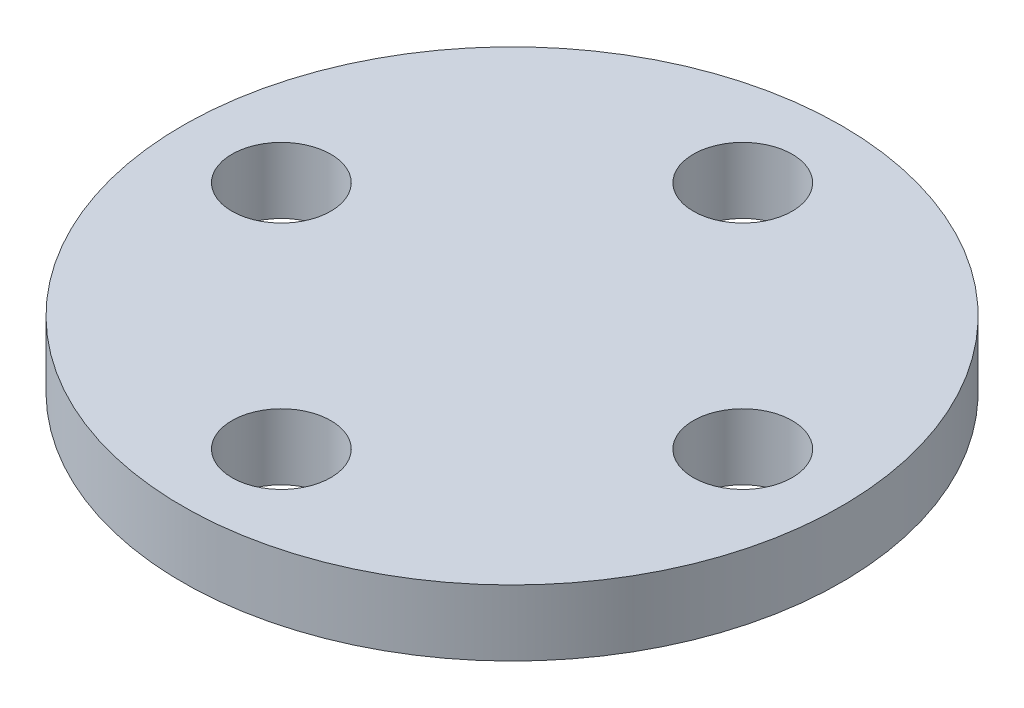
ISO-10303-21;
HEADER;
FILE_DESCRIPTION(('STEP AP214'),'2;1');
FILE_NAME('part.step','',(''),(''),'','','');
FILE_SCHEMA(('AUTOMOTIVE_DESIGN { 1 0 10303 214 1 1 1 1 }'));
ENDSEC;
DATA;
#1=APPLICATION_CONTEXT('core data for automotive mechanical design processes');
#2=APPLICATION_PROTOCOL_DEFINITION('international standard','automotive_design',2000,#1);
#3=PRODUCT_CONTEXT('',#1,'mechanical');
#4=PRODUCT('Part','Part','',(#3));
#5=PRODUCT_RELATED_PRODUCT_CATEGORY('part','',(#4));
#6=PRODUCT_DEFINITION_FORMATION('','',#4);
#7=PRODUCT_DEFINITION_CONTEXT('part definition',#1,'design');
#8=PRODUCT_DEFINITION('design','',#6,#7);
#9=PRODUCT_DEFINITION_SHAPE('','',#8);
#10=(LENGTH_UNIT() NAMED_UNIT(*) SI_UNIT(.MILLI.,.METRE.));
#11=(NAMED_UNIT(*) PLANE_ANGLE_UNIT() SI_UNIT($,.RADIAN.));
#12=(NAMED_UNIT(*) SI_UNIT($,.STERADIAN.) SOLID_ANGLE_UNIT());
#13=UNCERTAINTY_MEASURE_WITH_UNIT(LENGTH_MEASURE(1.E-05),#10,'distance_accuracy_value','');
#14=(GEOMETRIC_REPRESENTATION_CONTEXT(3) GLOBAL_UNCERTAINTY_ASSIGNED_CONTEXT((#13)) GLOBAL_UNIT_ASSIGNED_CONTEXT((#10,
#11,#12)) REPRESENTATION_CONTEXT('',''));
#15=CARTESIAN_POINT('',(0.,0.,0.));
#16=DIRECTION('',(0.,0.,1.));
#17=DIRECTION('',(1.,0.,0.));
#18=AXIS2_PLACEMENT_3D('',#15,#16,#17);
#19=CARTESIAN_POINT('',(0.,0.,0.));
#20=DIRECTION('',(0.,-1.,0.));
#21=DIRECTION('',(0.,0.,-1.));
#22=AXIS2_PLACEMENT_3D('',#19,#20,#21);
#23=CYLINDRICAL_SURFACE('',#22,2.75);
#24=CARTESIAN_POINT('',(0.,3.5,0.));
#25=DIRECTION('',(0.,-1.,0.));
#26=DIRECTION('',(0.,0.,-1.));
#27=AXIS2_PLACEMENT_3D('',#24,#25,#26);
#28=CIRCLE('',#27,2.75);
#29=CARTESIAN_POINT('',(0.,3.5,-2.75));
#30=VERTEX_POINT('',#29);
#31=EDGE_CURVE('E59',#30,#30,#28,.T.);
#32=ORIENTED_EDGE('',*,*,#31,.F.);
#33=EDGE_LOOP('',(#32));
#34=FACE_BOUND('',#33,.T.);
#35=CARTESIAN_POINT('',(0.,0.,0.));
#36=DIRECTION('',(0.,-1.,0.));
#37=DIRECTION('',(0.,0.,-1.));
#38=AXIS2_PLACEMENT_3D('',#35,#36,#37);
#39=CIRCLE('',#38,2.75);
#40=CARTESIAN_POINT('',(0.,0.,-2.75));
#41=VERTEX_POINT('',#40);
#42=EDGE_CURVE('E10',#41,#41,#39,.T.);
#43=ORIENTED_EDGE('',*,*,#42,.T.);
#44=EDGE_LOOP('',(#43));
#45=FACE_BOUND('',#44,.T.);
#46=ADVANCED_FACE('F37',(#34,#45),#23,.F.);
#47=CARTESIAN_POINT('',(-4.5,0.,0.));
#48=DIRECTION('',(0.,1.,0.));
#49=DIRECTION('',(0.,0.,1.));
#50=AXIS2_PLACEMENT_3D('',#47,#48,#49);
#51=PLANE('',#50);
#52=ORIENTED_EDGE('',*,*,#42,.F.);
#53=EDGE_LOOP('',(#52));
#54=FACE_BOUND('',#53,.T.);
#55=CARTESIAN_POINT('',(0.,0.,0.));
#56=DIRECTION('',(0.,-1.,0.));
#57=DIRECTION('',(0.,0.,-1.));
#58=AXIS2_PLACEMENT_3D('',#55,#56,#57);
#59=CIRCLE('',#58,4.5);
#60=CARTESIAN_POINT('',(0.,0.,-4.5));
#61=VERTEX_POINT('',#60);
#62=EDGE_CURVE('E43',#61,#61,#59,.T.);
#63=ORIENTED_EDGE('',*,*,#62,.T.);
#64=EDGE_LOOP('',(#63));
#65=FACE_BOUND('',#64,.T.);
#66=ADVANCED_FACE('F116',(#54,#65),#51,.F.);
#67=CARTESIAN_POINT('',(0.,0.,0.));
#68=DIRECTION('',(0.,-1.,0.));
#69=DIRECTION('',(0.,0.,-1.));
#70=AXIS2_PLACEMENT_3D('',#67,#68,#69);
#71=CYLINDRICAL_SURFACE('',#70,4.5);
#72=ORIENTED_EDGE('',*,*,#62,.F.);
#73=EDGE_LOOP('',(#72));
#74=FACE_BOUND('',#73,.T.);
#75=CARTESIAN_POINT('',(0.,2.5,0.));
#76=DIRECTION('',(0.,-1.,0.));
#77=DIRECTION('',(0.,0.,-1.));
#78=AXIS2_PLACEMENT_3D('',#75,#76,#77);
#79=CIRCLE('',#78,4.5);
#80=CARTESIAN_POINT('',(0.,2.5,-4.5));
#81=VERTEX_POINT('',#80);
#82=EDGE_CURVE('E47',#81,#81,#79,.T.);
#83=ORIENTED_EDGE('',*,*,#82,.T.);
#84=EDGE_LOOP('',(#83));
#85=FACE_BOUND('',#84,.T.);
#86=ADVANCED_FACE('F111',(#74,#85),#71,.T.);
#87=CARTESIAN_POINT('',(-10.,2.5,0.));
#88=DIRECTION('',(0.,1.,0.));
#89=DIRECTION('',(0.,0.,1.));
#90=AXIS2_PLACEMENT_3D('',#87,#88,#89);
#91=PLANE('',#90);
#92=CARTESIAN_POINT('',(0.,2.5,-7.));
#93=DIRECTION('',(0.,1.,0.));
#94=DIRECTION('',(0.,0.,1.));
#95=AXIS2_PLACEMENT_3D('',#92,#93,#94);
#96=CIRCLE('',#95,1.5);
#97=CARTESIAN_POINT('',(0.,2.5,-5.5));
#98=VERTEX_POINT('',#97);
#99=EDGE_CURVE('E62',#98,#98,#96,.F.);
#100=ORIENTED_EDGE('',*,*,#99,.F.);
#101=EDGE_LOOP('',(#100));
#102=FACE_BOUND('',#101,.T.);
#103=CARTESIAN_POINT('',(7.00000000000021,2.5,-2.04710281891367E-13));
#104=DIRECTION('',(0.,1.,0.));
#105=DIRECTION('',(0.,0.,1.));
#106=AXIS2_PLACEMENT_3D('',#103,#104,#105);
#107=CIRCLE('',#106,1.5);
#108=CARTESIAN_POINT('',(7.00000000000021,2.5,1.4999999999998));
#109=VERTEX_POINT('',#108);
#110=EDGE_CURVE('E73',#109,#109,#107,.F.);
#111=ORIENTED_EDGE('',*,*,#110,.F.);
#112=EDGE_LOOP('',(#111));
#113=FACE_BOUND('',#112,.T.);
#114=CARTESIAN_POINT('',(4.09420563782734E-13,2.5,7.));
#115=DIRECTION('',(0.,1.,0.));
#116=DIRECTION('',(0.,0.,1.));
#117=AXIS2_PLACEMENT_3D('',#114,#115,#116);
#118=CIRCLE('',#117,1.5);
#119=CARTESIAN_POINT('',(4.09420563782734E-13,2.5,8.5));
#120=VERTEX_POINT('',#119);
#121=EDGE_CURVE('E66',#120,#120,#118,.F.);
#122=ORIENTED_EDGE('',*,*,#121,.F.);
#123=EDGE_LOOP('',(#122));
#124=FACE_BOUND('',#123,.T.);
#125=CARTESIAN_POINT('',(-6.9999999999998,2.5,2.0556753465077E-13));
#126=DIRECTION('',(0.,1.,0.));
#127=DIRECTION('',(0.,0.,1.));
#128=AXIS2_PLACEMENT_3D('',#125,#126,#127);
#129=CIRCLE('',#128,1.5);
#130=CARTESIAN_POINT('',(-6.9999999999998,2.5,1.50000000000021));
#131=VERTEX_POINT('',#130);
#132=EDGE_CURVE('E67',#131,#131,#129,.F.);
#133=ORIENTED_EDGE('',*,*,#132,.F.);
#134=EDGE_LOOP('',(#133));
#135=FACE_BOUND('',#134,.T.);
#136=ORIENTED_EDGE('',*,*,#82,.F.);
#137=EDGE_LOOP('',(#136));
#138=FACE_BOUND('',#137,.T.);
#139=CARTESIAN_POINT('',(0.,2.5,0.));
#140=DIRECTION('',(0.,-1.,0.));
#141=DIRECTION('',(0.,0.,-1.));
#142=AXIS2_PLACEMENT_3D('',#139,#140,#141);
#143=CIRCLE('',#142,10.);
#144=CARTESIAN_POINT('',(0.,2.5,-10.));
#145=VERTEX_POINT('',#144);
#146=EDGE_CURVE('E51',#145,#145,#143,.T.);
#147=ORIENTED_EDGE('',*,*,#146,.T.);
#148=EDGE_LOOP('',(#147));
#149=FACE_BOUND('',#148,.T.);
#150=ADVANCED_FACE('F105',(#102,#113,#124,#135,#138,#149),#91,.F.);
#151=CARTESIAN_POINT('',(0.,0.,0.));
#152=DIRECTION('',(0.,-1.,0.));
#153=DIRECTION('',(0.,0.,-1.));
#154=AXIS2_PLACEMENT_3D('',#151,#152,#153);
#155=CYLINDRICAL_SURFACE('',#154,10.);
#156=ORIENTED_EDGE('',*,*,#146,.F.);
#157=EDGE_LOOP('',(#156));
#158=FACE_BOUND('',#157,.T.);
#159=CARTESIAN_POINT('',(0.,4.5,0.));
#160=DIRECTION('',(0.,-1.,0.));
#161=DIRECTION('',(0.,0.,-1.));
#162=AXIS2_PLACEMENT_3D('',#159,#160,#161);
#163=CIRCLE('',#162,10.);
#164=CARTESIAN_POINT('',(0.,4.5,-10.));
#165=VERTEX_POINT('',#164);
#166=EDGE_CURVE('E56',#165,#165,#163,.T.);
#167=ORIENTED_EDGE('',*,*,#166,.T.);
#168=EDGE_LOOP('',(#167));
#169=FACE_BOUND('',#168,.T.);
#170=ADVANCED_FACE('F94',(#158,#169),#155,.T.);
#171=CARTESIAN_POINT('',(0.,4.5,0.));
#172=DIRECTION('',(0.,-1.,0.));
#173=DIRECTION('',(0.,0.,-1.));
#174=AXIS2_PLACEMENT_3D('',#171,#172,#173);
#175=PLANE('',#174);
#176=CARTESIAN_POINT('',(0.,4.5,-7.));
#177=DIRECTION('',(0.,1.,0.));
#178=DIRECTION('',(0.,0.,1.));
#179=AXIS2_PLACEMENT_3D('',#176,#177,#178);
#180=CIRCLE('',#179,1.5);
#181=CARTESIAN_POINT('',(0.,4.5,-5.5));
#182=VERTEX_POINT('',#181);
#183=EDGE_CURVE('E79',#182,#182,#180,.T.);
#184=ORIENTED_EDGE('',*,*,#183,.F.);
#185=EDGE_LOOP('',(#184));
#186=FACE_BOUND('',#185,.T.);
#187=CARTESIAN_POINT('',(7.00000000000021,4.5,-2.04710281891367E-13));
#188=DIRECTION('',(0.,1.,0.));
#189=DIRECTION('',(0.,0.,1.));
#190=AXIS2_PLACEMENT_3D('',#187,#188,#189);
#191=CIRCLE('',#190,1.5);
#192=CARTESIAN_POINT('',(7.00000000000021,4.5,1.4999999999998));
#193=VERTEX_POINT('',#192);
#194=EDGE_CURVE('E76',#193,#193,#191,.T.);
#195=ORIENTED_EDGE('',*,*,#194,.F.);
#196=EDGE_LOOP('',(#195));
#197=FACE_BOUND('',#196,.T.);
#198=CARTESIAN_POINT('',(4.09420563782734E-13,4.5,7.));
#199=DIRECTION('',(0.,1.,0.));
#200=DIRECTION('',(0.,0.,1.));
#201=AXIS2_PLACEMENT_3D('',#198,#199,#200);
#202=CIRCLE('',#201,1.5);
#203=CARTESIAN_POINT('',(4.09420563782734E-13,4.5,8.5));
#204=VERTEX_POINT('',#203);
#205=EDGE_CURVE('E70',#204,#204,#202,.T.);
#206=ORIENTED_EDGE('',*,*,#205,.F.);
#207=EDGE_LOOP('',(#206));
#208=FACE_BOUND('',#207,.T.);
#209=CARTESIAN_POINT('',(-6.9999999999998,4.5,2.0556753465077E-13));
#210=DIRECTION('',(0.,1.,0.));
#211=DIRECTION('',(0.,0.,1.));
#212=AXIS2_PLACEMENT_3D('',#209,#210,#211);
#213=CIRCLE('',#212,1.5);
#214=CARTESIAN_POINT('',(-6.9999999999998,4.5,1.50000000000021));
#215=VERTEX_POINT('',#214);
#216=EDGE_CURVE('E63',#215,#215,#213,.T.);
#217=ORIENTED_EDGE('',*,*,#216,.F.);
#218=EDGE_LOOP('',(#217));
#219=FACE_BOUND('',#218,.T.);
#220=ORIENTED_EDGE('',*,*,#166,.F.);
#221=EDGE_LOOP('',(#220));
#222=FACE_BOUND('',#221,.T.);
#223=ADVANCED_FACE('F90',(#186,#197,#208,#219,#222),#175,.F.);
#224=CARTESIAN_POINT('',(-2.75,3.5,0.));
#225=DIRECTION('',(0.,1.,0.));
#226=DIRECTION('',(0.,0.,1.));
#227=AXIS2_PLACEMENT_3D('',#224,#225,#226);
#228=PLANE('',#227);
#229=ORIENTED_EDGE('',*,*,#31,.T.);
#230=EDGE_LOOP('',(#229));
#231=FACE_BOUND('',#230,.T.);
#232=ADVANCED_FACE('F93',(#231),#228,.F.);
#233=CARTESIAN_POINT('',(-6.9999999999998,-0.00100000000000013,2.0556753465077E-13));
#234=DIRECTION('',(0.,1.,0.));
#235=DIRECTION('',(0.,0.,1.));
#236=AXIS2_PLACEMENT_3D('',#233,#234,#235);
#237=CYLINDRICAL_SURFACE('',#236,1.5);
#238=ORIENTED_EDGE('',*,*,#216,.T.);
#239=EDGE_LOOP('',(#238));
#240=FACE_BOUND('',#239,.T.);
#241=ORIENTED_EDGE('',*,*,#132,.T.);
#242=EDGE_LOOP('',(#241));
#243=FACE_BOUND('',#242,.T.);
#244=ADVANCED_FACE('F125',(#240,#243),#237,.F.);
#245=CARTESIAN_POINT('',(4.09420563782734E-13,-0.00100000000000013,7.));
#246=DIRECTION('',(0.,1.,0.));
#247=DIRECTION('',(0.,0.,1.));
#248=AXIS2_PLACEMENT_3D('',#245,#246,#247);
#249=CYLINDRICAL_SURFACE('',#248,1.5);
#250=ORIENTED_EDGE('',*,*,#205,.T.);
#251=EDGE_LOOP('',(#250));
#252=FACE_BOUND('',#251,.T.);
#253=ORIENTED_EDGE('',*,*,#121,.T.);
#254=EDGE_LOOP('',(#253));
#255=FACE_BOUND('',#254,.T.);
#256=ADVANCED_FACE('F130',(#252,#255),#249,.F.);
#257=CARTESIAN_POINT('',(7.00000000000021,-0.00100000000000013,-2.04710281891367E-13));
#258=DIRECTION('',(0.,1.,0.));
#259=DIRECTION('',(0.,0.,1.));
#260=AXIS2_PLACEMENT_3D('',#257,#258,#259);
#261=CYLINDRICAL_SURFACE('',#260,1.5);
#262=ORIENTED_EDGE('',*,*,#194,.T.);
#263=EDGE_LOOP('',(#262));
#264=FACE_BOUND('',#263,.T.);
#265=ORIENTED_EDGE('',*,*,#110,.T.);
#266=EDGE_LOOP('',(#265));
#267=FACE_BOUND('',#266,.T.);
#268=ADVANCED_FACE('F136',(#264,#267),#261,.F.);
#269=CARTESIAN_POINT('',(0.,-0.00100000000000013,-7.));
#270=DIRECTION('',(0.,1.,0.));
#271=DIRECTION('',(0.,0.,1.));
#272=AXIS2_PLACEMENT_3D('',#269,#270,#271);
#273=CYLINDRICAL_SURFACE('',#272,1.5);
#274=ORIENTED_EDGE('',*,*,#183,.T.);
#275=EDGE_LOOP('',(#274));
#276=FACE_BOUND('',#275,.T.);
#277=ORIENTED_EDGE('',*,*,#99,.T.);
#278=EDGE_LOOP('',(#277));
#279=FACE_BOUND('',#278,.T.);
#280=ADVANCED_FACE('F87',(#276,#279),#273,.F.);
#281=CLOSED_SHELL('',(#46,#66,#86,#150,#170,#223,#232,#244,#256,#268,#280));
#282=MANIFOLD_SOLID_BREP('B2',#281);
#283=ADVANCED_BREP_SHAPE_REPRESENTATION('',(#18,#282),#14);
#284=SHAPE_DEFINITION_REPRESENTATION(#9,#283);
ENDSEC;
END-ISO-10303-21;
